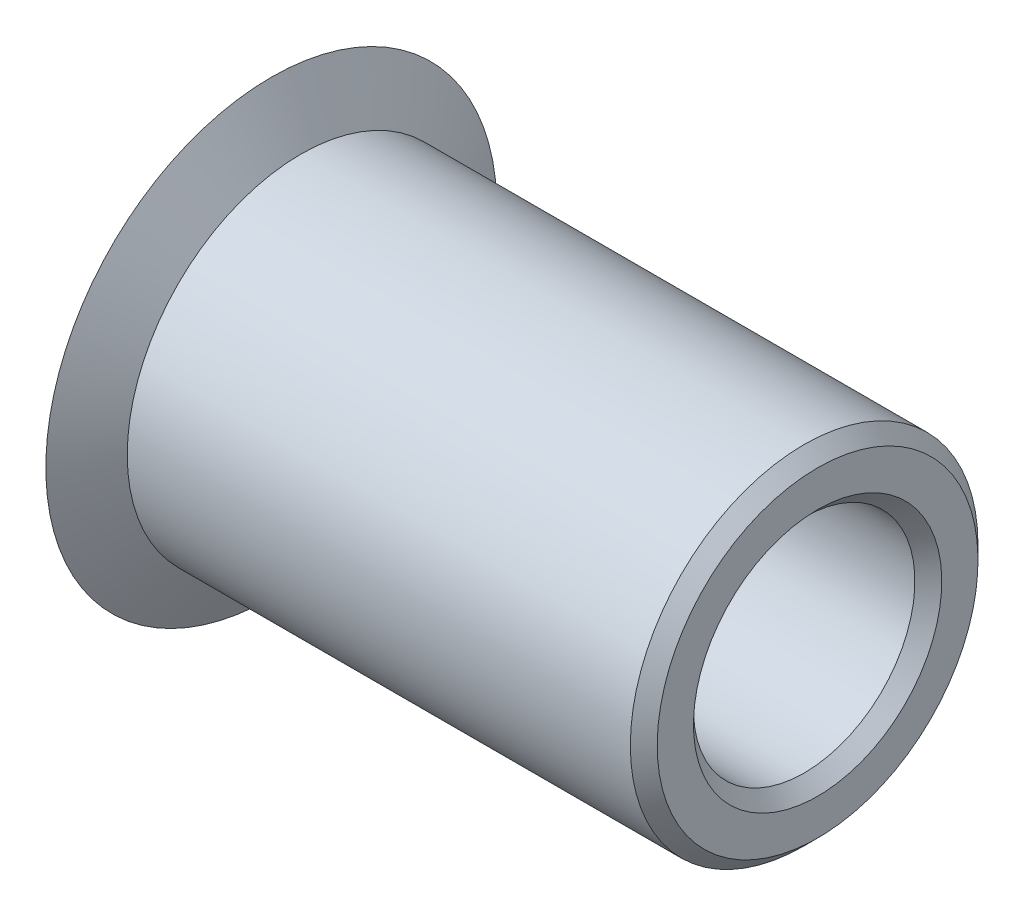
ISO-10303-21;
HEADER;
FILE_DESCRIPTION(('STEP AP214'),'2;1');
FILE_NAME('part.step','',(''),(''),'','','');
FILE_SCHEMA(('AUTOMOTIVE_DESIGN { 1 0 10303 214 1 1 1 1 }'));
ENDSEC;
DATA;
#1=APPLICATION_CONTEXT('core data for automotive mechanical design processes');
#2=APPLICATION_PROTOCOL_DEFINITION('international standard','automotive_design',2000,#1);
#3=PRODUCT_CONTEXT('',#1,'mechanical');
#4=PRODUCT('Part','Part','',(#3));
#5=PRODUCT_RELATED_PRODUCT_CATEGORY('part','',(#4));
#6=PRODUCT_DEFINITION_FORMATION('','',#4);
#7=PRODUCT_DEFINITION_CONTEXT('part definition',#1,'design');
#8=PRODUCT_DEFINITION('design','',#6,#7);
#9=PRODUCT_DEFINITION_SHAPE('','',#8);
#10=(LENGTH_UNIT() NAMED_UNIT(*) SI_UNIT(.MILLI.,.METRE.));
#11=(NAMED_UNIT(*) PLANE_ANGLE_UNIT() SI_UNIT($,.RADIAN.));
#12=(NAMED_UNIT(*) SI_UNIT($,.STERADIAN.) SOLID_ANGLE_UNIT());
#13=UNCERTAINTY_MEASURE_WITH_UNIT(LENGTH_MEASURE(1.E-05),#10,'distance_accuracy_value','');
#14=(GEOMETRIC_REPRESENTATION_CONTEXT(3) GLOBAL_UNCERTAINTY_ASSIGNED_CONTEXT((#13)) GLOBAL_UNIT_ASSIGNED_CONTEXT((#10,
#11,#12)) REPRESENTATION_CONTEXT('',''));
#15=CARTESIAN_POINT('',(0.,0.,0.));
#16=DIRECTION('',(0.,0.,1.));
#17=DIRECTION('',(1.,0.,0.));
#18=AXIS2_PLACEMENT_3D('',#15,#16,#17);
#19=CARTESIAN_POINT('',(7.02941274867817,0.,0.));
#20=DIRECTION('',(-1.,0.,0.));
#21=DIRECTION('',(0.,1.,0.));
#22=AXIS2_PLACEMENT_3D('',#19,#20,#21);
#23=CYLINDRICAL_SURFACE('',#22,2.229375);
#24=CARTESIAN_POINT('',(10.729375,0.,0.));
#25=DIRECTION('',(1.,0.,0.));
#26=DIRECTION('',(0.,1.,0.));
#27=AXIS2_PLACEMENT_3D('',#24,#25,#26);
#28=CIRCLE('',#27,2.229375);
#29=CARTESIAN_POINT('',(10.729375,2.229375,0.));
#30=VERTEX_POINT('',#29);
#31=EDGE_CURVE('E11',#30,#30,#28,.T.);
#32=ORIENTED_EDGE('',*,*,#31,.T.);
#33=EDGE_LOOP('',(#32));
#34=FACE_BOUND('',#33,.T.);
#35=CARTESIAN_POINT('',(3.32945049735633,0.,0.));
#36=DIRECTION('',(1.,0.,0.));
#37=DIRECTION('',(0.,1.,0.));
#38=AXIS2_PLACEMENT_3D('',#35,#36,#37);
#39=CIRCLE('',#38,2.229375);
#40=CARTESIAN_POINT('',(3.32945049735633,2.229375,0.));
#41=VERTEX_POINT('',#40);
#42=EDGE_CURVE('E50',#41,#41,#39,.T.);
#43=ORIENTED_EDGE('',*,*,#42,.F.);
#44=EDGE_LOOP('',(#43));
#45=FACE_BOUND('',#44,.T.);
#46=ADVANCED_FACE('F16',(#34,#45),#23,.F.);
#47=CARTESIAN_POINT('',(10.8646875,0.,0.));
#48=DIRECTION('',(1.,0.,0.));
#49=DIRECTION('',(0.,1.,0.));
#50=AXIS2_PLACEMENT_3D('',#47,#48,#49);
#51=CONICAL_SURFACE('',#50,2.3646875,0.785398163397447);
#52=CARTESIAN_POINT('',(11.,0.,0.));
#53=DIRECTION('',(1.,0.,0.));
#54=DIRECTION('',(0.,1.,0.));
#55=AXIS2_PLACEMENT_3D('',#52,#53,#54);
#56=CIRCLE('',#55,2.5);
#57=CARTESIAN_POINT('',(11.,2.5,0.));
#58=VERTEX_POINT('',#57);
#59=EDGE_CURVE('E25',#58,#58,#56,.T.);
#60=ORIENTED_EDGE('',*,*,#59,.T.);
#61=EDGE_LOOP('',(#60));
#62=FACE_BOUND('',#61,.T.);
#63=ORIENTED_EDGE('',*,*,#31,.F.);
#64=EDGE_LOOP('',(#63));
#65=FACE_BOUND('',#64,.T.);
#66=ADVANCED_FACE('F78',(#62,#65),#51,.F.);
#67=CARTESIAN_POINT('',(11.,2.8646875,0.));
#68=DIRECTION('',(1.,0.,0.));
#69=DIRECTION('',(0.,1.,0.));
#70=AXIS2_PLACEMENT_3D('',#67,#68,#69);
#71=PLANE('',#70);
#72=CARTESIAN_POINT('',(11.,0.,0.));
#73=DIRECTION('',(1.,0.,0.));
#74=DIRECTION('',(0.,1.,0.));
#75=AXIS2_PLACEMENT_3D('',#72,#73,#74);
#76=CIRCLE('',#75,3.229375);
#77=CARTESIAN_POINT('',(11.,3.229375,0.));
#78=VERTEX_POINT('',#77);
#79=EDGE_CURVE('E61',#78,#78,#76,.T.);
#80=ORIENTED_EDGE('',*,*,#79,.T.);
#81=EDGE_LOOP('',(#80));
#82=FACE_BOUND('',#81,.T.);
#83=ORIENTED_EDGE('',*,*,#59,.F.);
#84=EDGE_LOOP('',(#83));
#85=FACE_BOUND('',#84,.T.);
#86=ADVANCED_FACE('F81',(#82,#85),#71,.T.);
#87=CARTESIAN_POINT('',(10.8646875,0.,0.));
#88=DIRECTION('',(-1.,0.,0.));
#89=DIRECTION('',(0.,1.,0.));
#90=AXIS2_PLACEMENT_3D('',#87,#88,#89);
#91=CONICAL_SURFACE('',#90,3.3646875,0.785398163397447);
#92=CARTESIAN_POINT('',(10.729375,0.,0.));
#93=DIRECTION('',(1.,0.,0.));
#94=DIRECTION('',(0.,1.,0.));
#95=AXIS2_PLACEMENT_3D('',#92,#93,#94);
#96=CIRCLE('',#95,3.5);
#97=CARTESIAN_POINT('',(10.729375,3.5,0.));
#98=VERTEX_POINT('',#97);
#99=EDGE_CURVE('E65',#98,#98,#96,.T.);
#100=ORIENTED_EDGE('',*,*,#99,.T.);
#101=EDGE_LOOP('',(#100));
#102=FACE_BOUND('',#101,.T.);
#103=ORIENTED_EDGE('',*,*,#79,.F.);
#104=EDGE_LOOP('',(#103));
#105=FACE_BOUND('',#104,.T.);
#106=ADVANCED_FACE('F66',(#102,#105),#91,.T.);
#107=CARTESIAN_POINT('',(5.6646875,0.,0.));
#108=DIRECTION('',(-1.,0.,0.));
#109=DIRECTION('',(0.,1.,0.));
#110=AXIS2_PLACEMENT_3D('',#107,#108,#109);
#111=CYLINDRICAL_SURFACE('',#110,3.5);
#112=CARTESIAN_POINT('',(0.6,0.,0.));
#113=DIRECTION('',(1.,0.,0.));
#114=DIRECTION('',(0.,1.,0.));
#115=AXIS2_PLACEMENT_3D('',#112,#113,#114);
#116=CIRCLE('',#115,3.5);
#117=CARTESIAN_POINT('',(0.6,3.5,0.));
#118=VERTEX_POINT('',#117);
#119=EDGE_CURVE('E69',#118,#118,#116,.T.);
#120=ORIENTED_EDGE('',*,*,#119,.T.);
#121=EDGE_LOOP('',(#120));
#122=FACE_BOUND('',#121,.T.);
#123=ORIENTED_EDGE('',*,*,#99,.F.);
#124=EDGE_LOOP('',(#123));
#125=FACE_BOUND('',#124,.T.);
#126=ADVANCED_FACE('F89',(#122,#125),#111,.T.);
#127=CARTESIAN_POINT('',(0.3,0.,0.));
#128=DIRECTION('',(-1.,0.,0.));
#129=DIRECTION('',(0.,1.,0.));
#130=AXIS2_PLACEMENT_3D('',#127,#128,#129);
#131=CONICAL_SURFACE('',#130,4.0196,1.04718484902493);
#132=CARTESIAN_POINT('',(0.,0.,0.));
#133=DIRECTION('',(1.,0.,0.));
#134=DIRECTION('',(0.,1.,0.));
#135=AXIS2_PLACEMENT_3D('',#132,#133,#134);
#136=CIRCLE('',#135,4.5392);
#137=CARTESIAN_POINT('',(0.,4.5392,0.));
#138=VERTEX_POINT('',#137);
#139=EDGE_CURVE('E19',#138,#138,#136,.T.);
#140=ORIENTED_EDGE('',*,*,#139,.T.);
#141=EDGE_LOOP('',(#140));
#142=FACE_BOUND('',#141,.T.);
#143=ORIENTED_EDGE('',*,*,#119,.F.);
#144=EDGE_LOOP('',(#143));
#145=FACE_BOUND('',#144,.T.);
#146=ADVANCED_FACE('F125',(#142,#145),#131,.T.);
#147=CARTESIAN_POINT('',(0.,3.6696,0.));
#148=DIRECTION('',(-1.,0.,0.));
#149=DIRECTION('',(0.,-1.,0.));
#150=AXIS2_PLACEMENT_3D('',#147,#148,#149);
#151=PLANE('',#150);
#152=CARTESIAN_POINT('',(0.,0.,0.));
#153=DIRECTION('',(1.,0.,0.));
#154=DIRECTION('',(0.,1.,0.));
#155=AXIS2_PLACEMENT_3D('',#152,#153,#154);
#156=CIRCLE('',#155,2.8);
#157=CARTESIAN_POINT('',(0.,2.8,0.));
#158=VERTEX_POINT('',#157);
#159=EDGE_CURVE('E42',#158,#158,#156,.T.);
#160=ORIENTED_EDGE('',*,*,#159,.T.);
#161=EDGE_LOOP('',(#160));
#162=FACE_BOUND('',#161,.T.);
#163=ORIENTED_EDGE('',*,*,#139,.F.);
#164=EDGE_LOOP('',(#163));
#165=FACE_BOUND('',#164,.T.);
#166=ADVANCED_FACE('F135',(#162,#165),#151,.T.);
#167=CARTESIAN_POINT('',(1.5,0.,0.));
#168=DIRECTION('',(-1.,0.,0.));
#169=DIRECTION('',(0.,1.,0.));
#170=AXIS2_PLACEMENT_3D('',#167,#168,#169);
#171=CYLINDRICAL_SURFACE('',#170,2.8);
#172=CARTESIAN_POINT('',(3.,0.,0.));
#173=DIRECTION('',(1.,0.,0.));
#174=DIRECTION('',(0.,1.,0.));
#175=AXIS2_PLACEMENT_3D('',#172,#173,#174);
#176=CIRCLE('',#175,2.8);
#177=CARTESIAN_POINT('',(3.,2.8,0.));
#178=VERTEX_POINT('',#177);
#179=EDGE_CURVE('E55',#178,#178,#176,.T.);
#180=ORIENTED_EDGE('',*,*,#179,.T.);
#181=EDGE_LOOP('',(#180));
#182=FACE_BOUND('',#181,.T.);
#183=ORIENTED_EDGE('',*,*,#159,.F.);
#184=EDGE_LOOP('',(#183));
#185=FACE_BOUND('',#184,.T.);
#186=ADVANCED_FACE('F145',(#182,#185),#171,.F.);
#187=CARTESIAN_POINT('',(3.16472524867816,0.,0.));
#188=DIRECTION('',(-1.,0.,0.));
#189=DIRECTION('',(0.,1.,0.));
#190=AXIS2_PLACEMENT_3D('',#187,#188,#189);
#191=CONICAL_SURFACE('',#190,2.5146875,1.0471975511966);
#192=ORIENTED_EDGE('',*,*,#42,.T.);
#193=EDGE_LOOP('',(#192));
#194=FACE_BOUND('',#193,.T.);
#195=ORIENTED_EDGE('',*,*,#179,.F.);
#196=EDGE_LOOP('',(#195));
#197=FACE_BOUND('',#196,.T.);
#198=ADVANCED_FACE('F153',(#194,#197),#191,.F.);
#199=CLOSED_SHELL('',(#46,#66,#86,#106,#126,#146,#166,#186,#198));
#200=MANIFOLD_SOLID_BREP('B1',#199);
#201=ADVANCED_BREP_SHAPE_REPRESENTATION('',(#18,#200),#14);
#202=SHAPE_DEFINITION_REPRESENTATION(#9,#201);
ENDSEC;
END-ISO-10303-21;
